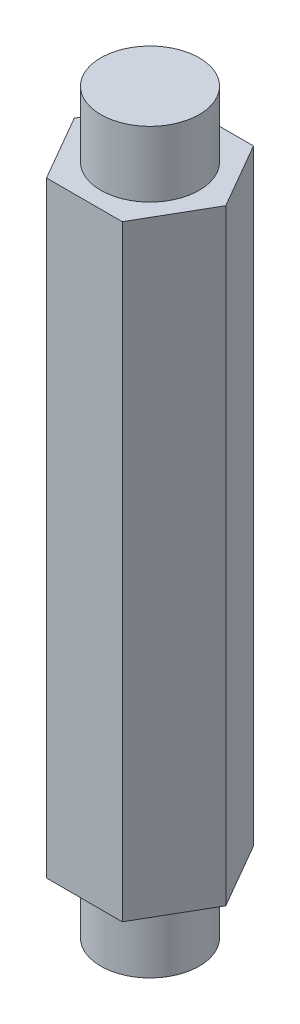
ISO-10303-21;
HEADER;
FILE_DESCRIPTION(('STEP AP214'),'2;1');
FILE_NAME('part.step','',(''),(''),'','','');
FILE_SCHEMA(('AUTOMOTIVE_DESIGN { 1 0 10303 214 1 1 1 1 }'));
ENDSEC;
DATA;
#1=APPLICATION_CONTEXT('core data for automotive mechanical design processes');
#2=APPLICATION_PROTOCOL_DEFINITION('international standard','automotive_design',2000,#1);
#3=PRODUCT_CONTEXT('',#1,'mechanical');
#4=PRODUCT('Part','Part','',(#3));
#5=PRODUCT_RELATED_PRODUCT_CATEGORY('part','',(#4));
#6=PRODUCT_DEFINITION_FORMATION('','',#4);
#7=PRODUCT_DEFINITION_CONTEXT('part definition',#1,'design');
#8=PRODUCT_DEFINITION('design','',#6,#7);
#9=PRODUCT_DEFINITION_SHAPE('','',#8);
#10=(LENGTH_UNIT() NAMED_UNIT(*) SI_UNIT(.MILLI.,.METRE.));
#11=(NAMED_UNIT(*) PLANE_ANGLE_UNIT() SI_UNIT($,.RADIAN.));
#12=(NAMED_UNIT(*) SI_UNIT($,.STERADIAN.) SOLID_ANGLE_UNIT());
#13=UNCERTAINTY_MEASURE_WITH_UNIT(LENGTH_MEASURE(1.E-05),#10,'distance_accuracy_value','');
#14=(GEOMETRIC_REPRESENTATION_CONTEXT(3) GLOBAL_UNCERTAINTY_ASSIGNED_CONTEXT((#13)) GLOBAL_UNIT_ASSIGNED_CONTEXT((#10,
#11,#12)) REPRESENTATION_CONTEXT('',''));
#15=CARTESIAN_POINT('',(0.,0.,0.));
#16=DIRECTION('',(0.,0.,1.));
#17=DIRECTION('',(1.,0.,0.));
#18=AXIS2_PLACEMENT_3D('',#15,#16,#17);
#19=CARTESIAN_POINT('',(3.6661742093542,58.68,6.34999999999996));
#20=DIRECTION('',(-0.866025403784441,0.,-0.499999999999995));
#21=DIRECTION('',(-0.499999999999995,0.,0.866025403784442));
#22=AXIS2_PLACEMENT_3D('',#19,#20,#21);
#23=PLANE('',#22);
#24=DIRECTION('',(0.499999999999995,0.,-0.866025403784442));
#25=VECTOR('',#24,1.);
#26=CARTESIAN_POINT('',(3.6661742093542,0.,6.34999999999996));
#27=LINE('',#26,#25);
#28=CARTESIAN_POINT('',(3.6661742093542,0.,6.34999999999996));
#29=VERTEX_POINT('',#28);
#30=CARTESIAN_POINT('',(7.33234841870825,0.,0.));
#31=VERTEX_POINT('',#30);
#32=EDGE_CURVE('E128',#29,#31,#27,.T.);
#33=ORIENTED_EDGE('',*,*,#32,.T.);
#34=DIRECTION('',(0.,-1.,0.));
#35=VECTOR('',#34,1.);
#36=CARTESIAN_POINT('',(7.33234841870825,58.68,0.));
#37=LINE('',#36,#35);
#38=CARTESIAN_POINT('',(7.33234841870825,58.68,0.));
#39=VERTEX_POINT('',#38);
#40=EDGE_CURVE('E44',#39,#31,#37,.T.);
#41=ORIENTED_EDGE('',*,*,#40,.F.);
#42=DIRECTION('',(0.499999999999995,0.,-0.866025403784442));
#43=VECTOR('',#42,1.);
#44=CARTESIAN_POINT('',(3.6661742093542,58.68,6.34999999999996));
#45=LINE('',#44,#43);
#46=CARTESIAN_POINT('',(3.6661742093542,58.68,6.34999999999996));
#47=VERTEX_POINT('',#46);
#48=EDGE_CURVE('E139',#47,#39,#45,.T.);
#49=ORIENTED_EDGE('',*,*,#48,.F.);
#50=DIRECTION('',(0.,-1.,0.));
#51=VECTOR('',#50,1.);
#52=CARTESIAN_POINT('',(3.6661742093542,58.68,6.34999999999996));
#53=LINE('',#52,#51);
#54=EDGE_CURVE('E124',#47,#29,#53,.T.);
#55=ORIENTED_EDGE('',*,*,#54,.T.);
#56=EDGE_LOOP('',(#33,#41,#49,#55));
#57=FACE_BOUND('',#56,.T.);
#58=ADVANCED_FACE('F41',(#57),#23,.F.);
#59=CARTESIAN_POINT('',(7.33234841870825,58.68,0.));
#60=DIRECTION('',(-0.866025403784438,0.,0.500000000000001));
#61=DIRECTION('',(0.500000000000001,0.,0.866025403784438));
#62=AXIS2_PLACEMENT_3D('',#59,#60,#61);
#63=PLANE('',#62);
#64=DIRECTION('',(-0.500000000000001,0.,-0.866025403784438));
#65=VECTOR('',#64,1.);
#66=CARTESIAN_POINT('',(7.33234841870825,0.,0.));
#67=LINE('',#66,#65);
#68=CARTESIAN_POINT('',(3.66617420935411,0.,-6.35000000000001));
#69=VERTEX_POINT('',#68);
#70=EDGE_CURVE('E131',#31,#69,#67,.T.);
#71=ORIENTED_EDGE('',*,*,#70,.T.);
#72=DIRECTION('',(0.,-1.,0.));
#73=VECTOR('',#72,1.);
#74=CARTESIAN_POINT('',(3.66617420935411,58.68,-6.35000000000001));
#75=LINE('',#74,#73);
#76=CARTESIAN_POINT('',(3.66617420935411,58.68,-6.35000000000001));
#77=VERTEX_POINT('',#76);
#78=EDGE_CURVE('E142',#77,#69,#75,.T.);
#79=ORIENTED_EDGE('',*,*,#78,.F.);
#80=DIRECTION('',(-0.500000000000001,0.,-0.866025403784438));
#81=VECTOR('',#80,1.);
#82=CARTESIAN_POINT('',(7.33234841870825,58.68,0.));
#83=LINE('',#82,#81);
#84=EDGE_CURVE('E97',#39,#77,#83,.T.);
#85=ORIENTED_EDGE('',*,*,#84,.F.);
#86=ORIENTED_EDGE('',*,*,#40,.T.);
#87=EDGE_LOOP('',(#71,#79,#85,#86));
#88=FACE_BOUND('',#87,.T.);
#89=ADVANCED_FACE('F155',(#88),#63,.F.);
#90=CARTESIAN_POINT('',(3.66617420935411,58.68,-6.35000000000001));
#91=DIRECTION('',(0.,0.,1.));
#92=DIRECTION('',(1.,0.,0.));
#93=AXIS2_PLACEMENT_3D('',#90,#91,#92);
#94=PLANE('',#93);
#95=DIRECTION('',(-1.,0.,0.));
#96=VECTOR('',#95,1.);
#97=CARTESIAN_POINT('',(3.66617420935411,0.,-6.35000000000001));
#98=LINE('',#97,#96);
#99=CARTESIAN_POINT('',(-3.66617420935415,0.,-6.34999999999999));
#100=VERTEX_POINT('',#99);
#101=EDGE_CURVE('E134',#69,#100,#98,.T.);
#102=ORIENTED_EDGE('',*,*,#101,.T.);
#103=DIRECTION('',(0.,-1.,0.));
#104=VECTOR('',#103,1.);
#105=CARTESIAN_POINT('',(-3.66617420935415,58.68,-6.34999999999999));
#106=LINE('',#105,#104);
#107=CARTESIAN_POINT('',(-3.66617420935415,58.68,-6.34999999999999));
#108=VERTEX_POINT('',#107);
#109=EDGE_CURVE('E119',#108,#100,#106,.T.);
#110=ORIENTED_EDGE('',*,*,#109,.F.);
#111=DIRECTION('',(-1.,0.,0.));
#112=VECTOR('',#111,1.);
#113=CARTESIAN_POINT('',(3.66617420935411,58.68,-6.35000000000001));
#114=LINE('',#113,#112);
#115=EDGE_CURVE('E110',#77,#108,#114,.T.);
#116=ORIENTED_EDGE('',*,*,#115,.F.);
#117=ORIENTED_EDGE('',*,*,#78,.T.);
#118=EDGE_LOOP('',(#102,#110,#116,#117));
#119=FACE_BOUND('',#118,.T.);
#120=ADVANCED_FACE('F156',(#119),#94,.F.);
#121=CARTESIAN_POINT('',(-3.66617420935415,58.68,-6.34999999999999));
#122=DIRECTION('',(0.866025403784441,0.,0.499999999999995));
#123=DIRECTION('',(0.499999999999995,0.,-0.866025403784442));
#124=AXIS2_PLACEMENT_3D('',#121,#122,#123);
#125=PLANE('',#124);
#126=DIRECTION('',(-0.499999999999995,0.,0.866025403784442));
#127=VECTOR('',#126,1.);
#128=CARTESIAN_POINT('',(-3.66617420935415,0.,-6.34999999999999));
#129=LINE('',#128,#127);
#130=CARTESIAN_POINT('',(-7.33234841870825,0.,0.));
#131=VERTEX_POINT('',#130);
#132=EDGE_CURVE('E118',#100,#131,#129,.T.);
#133=ORIENTED_EDGE('',*,*,#132,.T.);
#134=DIRECTION('',(0.,-1.,0.));
#135=VECTOR('',#134,1.);
#136=CARTESIAN_POINT('',(-7.33234841870825,58.68,0.));
#137=LINE('',#136,#135);
#138=CARTESIAN_POINT('',(-7.33234841870825,58.68,0.));
#139=VERTEX_POINT('',#138);
#140=EDGE_CURVE('E115',#139,#131,#137,.T.);
#141=ORIENTED_EDGE('',*,*,#140,.F.);
#142=DIRECTION('',(-0.499999999999995,0.,0.866025403784442));
#143=VECTOR('',#142,1.);
#144=CARTESIAN_POINT('',(-3.66617420935415,58.68,-6.34999999999999));
#145=LINE('',#144,#143);
#146=EDGE_CURVE('E104',#108,#139,#145,.T.);
#147=ORIENTED_EDGE('',*,*,#146,.F.);
#148=ORIENTED_EDGE('',*,*,#109,.T.);
#149=EDGE_LOOP('',(#133,#141,#147,#148));
#150=FACE_BOUND('',#149,.T.);
#151=ADVANCED_FACE('F116',(#150),#125,.F.);
#152=CARTESIAN_POINT('',(-7.33234841870825,58.68,0.));
#153=DIRECTION('',(0.866025403784435,0.,-0.500000000000007));
#154=DIRECTION('',(-0.500000000000007,0.,-0.866025403784435));
#155=AXIS2_PLACEMENT_3D('',#152,#153,#154);
#156=PLANE('',#155);
#157=DIRECTION('',(0.500000000000007,0.,0.866025403784434));
#158=VECTOR('',#157,1.);
#159=CARTESIAN_POINT('',(-7.33234841870825,0.,0.));
#160=LINE('',#159,#158);
#161=CARTESIAN_POINT('',(-3.66617420935407,0.,6.35000000000004));
#162=VERTEX_POINT('',#161);
#163=EDGE_CURVE('E82',#131,#162,#160,.T.);
#164=ORIENTED_EDGE('',*,*,#163,.T.);
#165=DIRECTION('',(0.,-1.,0.));
#166=VECTOR('',#165,1.);
#167=CARTESIAN_POINT('',(-3.66617420935407,58.68,6.35000000000004));
#168=LINE('',#167,#166);
#169=CARTESIAN_POINT('',(-3.66617420935407,58.68,6.35000000000004));
#170=VERTEX_POINT('',#169);
#171=EDGE_CURVE('E120',#170,#162,#168,.T.);
#172=ORIENTED_EDGE('',*,*,#171,.F.);
#173=DIRECTION('',(0.500000000000007,0.,0.866025403784434));
#174=VECTOR('',#173,1.);
#175=CARTESIAN_POINT('',(-7.33234841870825,58.68,0.));
#176=LINE('',#175,#174);
#177=EDGE_CURVE('E108',#139,#170,#176,.T.);
#178=ORIENTED_EDGE('',*,*,#177,.F.);
#179=ORIENTED_EDGE('',*,*,#140,.T.);
#180=EDGE_LOOP('',(#164,#172,#178,#179));
#181=FACE_BOUND('',#180,.T.);
#182=ADVANCED_FACE('F122',(#181),#156,.F.);
#183=CARTESIAN_POINT('',(-3.66617420935407,58.68,6.35000000000004));
#184=DIRECTION('',(0.,0.,-1.));
#185=DIRECTION('',(-1.,0.,0.));
#186=AXIS2_PLACEMENT_3D('',#183,#184,#185);
#187=PLANE('',#186);
#188=DIRECTION('',(1.,0.,0.));
#189=VECTOR('',#188,1.);
#190=CARTESIAN_POINT('',(-3.66617420935407,0.,6.35000000000004));
#191=LINE('',#190,#189);
#192=EDGE_CURVE('E88',#162,#29,#191,.T.);
#193=ORIENTED_EDGE('',*,*,#192,.T.);
#194=ORIENTED_EDGE('',*,*,#54,.F.);
#195=DIRECTION('',(1.,0.,0.));
#196=VECTOR('',#195,1.);
#197=CARTESIAN_POINT('',(-3.66617420935407,58.68,6.35000000000004));
#198=LINE('',#197,#196);
#199=EDGE_CURVE('E59',#170,#47,#198,.T.);
#200=ORIENTED_EDGE('',*,*,#199,.F.);
#201=ORIENTED_EDGE('',*,*,#171,.T.);
#202=EDGE_LOOP('',(#193,#194,#200,#201));
#203=FACE_BOUND('',#202,.T.);
#204=ADVANCED_FACE('F161',(#203),#187,.F.);
#205=CARTESIAN_POINT('',(0.,58.68,0.));
#206=DIRECTION('',(0.,1.,0.));
#207=DIRECTION('',(0.,0.,1.));
#208=AXIS2_PLACEMENT_3D('',#205,#206,#207);
#209=PLANE('',#208);
#210=CARTESIAN_POINT('',(0.,58.68,0.));
#211=DIRECTION('',(0.,1.,0.));
#212=DIRECTION('',(0.,0.,1.));
#213=AXIS2_PLACEMENT_3D('',#210,#211,#212);
#214=CIRCLE('',#213,4.7625);
#215=CARTESIAN_POINT('',(0.,58.68,4.7625));
#216=VERTEX_POINT('',#215);
#217=EDGE_CURVE('E50',#216,#216,#214,.T.);
#218=ORIENTED_EDGE('',*,*,#217,.F.);
#219=EDGE_LOOP('',(#218));
#220=FACE_BOUND('',#219,.T.);
#221=ORIENTED_EDGE('',*,*,#48,.T.);
#222=ORIENTED_EDGE('',*,*,#84,.T.);
#223=ORIENTED_EDGE('',*,*,#115,.T.);
#224=ORIENTED_EDGE('',*,*,#146,.T.);
#225=ORIENTED_EDGE('',*,*,#177,.T.);
#226=ORIENTED_EDGE('',*,*,#199,.T.);
#227=EDGE_LOOP('',(#221,#222,#223,#224,#225,#226));
#228=FACE_BOUND('',#227,.T.);
#229=ADVANCED_FACE('F106',(#220,#228),#209,.T.);
#230=CARTESIAN_POINT('',(0.,0.,0.));
#231=DIRECTION('',(0.,1.,0.));
#232=DIRECTION('',(0.,0.,1.));
#233=AXIS2_PLACEMENT_3D('',#230,#231,#232);
#234=PLANE('',#233);
#235=CARTESIAN_POINT('',(0.,0.,0.));
#236=DIRECTION('',(0.,-1.,0.));
#237=DIRECTION('',(0.,0.,-1.));
#238=AXIS2_PLACEMENT_3D('',#235,#236,#237);
#239=CIRCLE('',#238,4.7625);
#240=CARTESIAN_POINT('',(0.,0.,-4.7625));
#241=VERTEX_POINT('',#240);
#242=EDGE_CURVE('E11',#241,#241,#239,.T.);
#243=ORIENTED_EDGE('',*,*,#242,.F.);
#244=EDGE_LOOP('',(#243));
#245=FACE_BOUND('',#244,.T.);
#246=ORIENTED_EDGE('',*,*,#32,.F.);
#247=ORIENTED_EDGE('',*,*,#192,.F.);
#248=ORIENTED_EDGE('',*,*,#163,.F.);
#249=ORIENTED_EDGE('',*,*,#132,.F.);
#250=ORIENTED_EDGE('',*,*,#101,.F.);
#251=ORIENTED_EDGE('',*,*,#70,.F.);
#252=EDGE_LOOP('',(#246,#247,#248,#249,#250,#251));
#253=FACE_BOUND('',#252,.T.);
#254=ADVANCED_FACE('F159',(#245,#253),#234,.F.);
#255=CARTESIAN_POINT('',(0.,65.03,0.));
#256=DIRECTION('',(0.,-1.,0.));
#257=DIRECTION('',(0.,0.,-1.));
#258=AXIS2_PLACEMENT_3D('',#255,#256,#257);
#259=CYLINDRICAL_SURFACE('',#258,4.7625);
#260=CARTESIAN_POINT('',(0.,65.03,0.));
#261=DIRECTION('',(0.,1.,0.));
#262=DIRECTION('',(0.,0.,1.));
#263=AXIS2_PLACEMENT_3D('',#260,#261,#262);
#264=CIRCLE('',#263,4.7625);
#265=CARTESIAN_POINT('',(0.,65.03,4.7625));
#266=VERTEX_POINT('',#265);
#267=EDGE_CURVE('E132',#266,#266,#264,.T.);
#268=ORIENTED_EDGE('',*,*,#267,.F.);
#269=EDGE_LOOP('',(#268));
#270=FACE_BOUND('',#269,.T.);
#271=ORIENTED_EDGE('',*,*,#217,.T.);
#272=EDGE_LOOP('',(#271));
#273=FACE_BOUND('',#272,.T.);
#274=ADVANCED_FACE('F212',(#270,#273),#259,.T.);
#275=CARTESIAN_POINT('',(0.,65.03,0.));
#276=DIRECTION('',(0.,1.,0.));
#277=DIRECTION('',(0.,0.,1.));
#278=AXIS2_PLACEMENT_3D('',#275,#276,#277);
#279=PLANE('',#278);
#280=ORIENTED_EDGE('',*,*,#267,.T.);
#281=EDGE_LOOP('',(#280));
#282=FACE_BOUND('',#281,.T.);
#283=ADVANCED_FACE('F222',(#282),#279,.T.);
#284=CARTESIAN_POINT('',(0.,-6.35,0.));
#285=DIRECTION('',(0.,1.,0.));
#286=DIRECTION('',(0.,0.,1.));
#287=AXIS2_PLACEMENT_3D('',#284,#285,#286);
#288=CYLINDRICAL_SURFACE('',#287,4.7625);
#289=CARTESIAN_POINT('',(0.,-6.35,0.));
#290=DIRECTION('',(0.,-1.,0.));
#291=DIRECTION('',(0.,0.,-1.));
#292=AXIS2_PLACEMENT_3D('',#289,#290,#291);
#293=CIRCLE('',#292,4.7625);
#294=CARTESIAN_POINT('',(0.,-6.35,-4.7625));
#295=VERTEX_POINT('',#294);
#296=EDGE_CURVE('E255',#295,#295,#293,.T.);
#297=ORIENTED_EDGE('',*,*,#296,.F.);
#298=EDGE_LOOP('',(#297));
#299=FACE_BOUND('',#298,.T.);
#300=ORIENTED_EDGE('',*,*,#242,.T.);
#301=EDGE_LOOP('',(#300));
#302=FACE_BOUND('',#301,.T.);
#303=ADVANCED_FACE('F231',(#299,#302),#288,.T.);
#304=CARTESIAN_POINT('',(0.,-6.35,0.));
#305=DIRECTION('',(0.,-1.,0.));
#306=DIRECTION('',(0.,0.,-1.));
#307=AXIS2_PLACEMENT_3D('',#304,#305,#306);
#308=PLANE('',#307);
#309=ORIENTED_EDGE('',*,*,#296,.T.);
#310=EDGE_LOOP('',(#309));
#311=FACE_BOUND('',#310,.T.);
#312=ADVANCED_FACE('F240',(#311),#308,.T.);
#313=CLOSED_SHELL('',(#58,#89,#120,#151,#182,#204,#229,#254,#274,#283,#303,#312));
#314=MANIFOLD_SOLID_BREP('B2',#313);
#315=ADVANCED_BREP_SHAPE_REPRESENTATION('',(#18,#314),#14);
#316=SHAPE_DEFINITION_REPRESENTATION(#9,#315);
ENDSEC;
END-ISO-10303-21;
